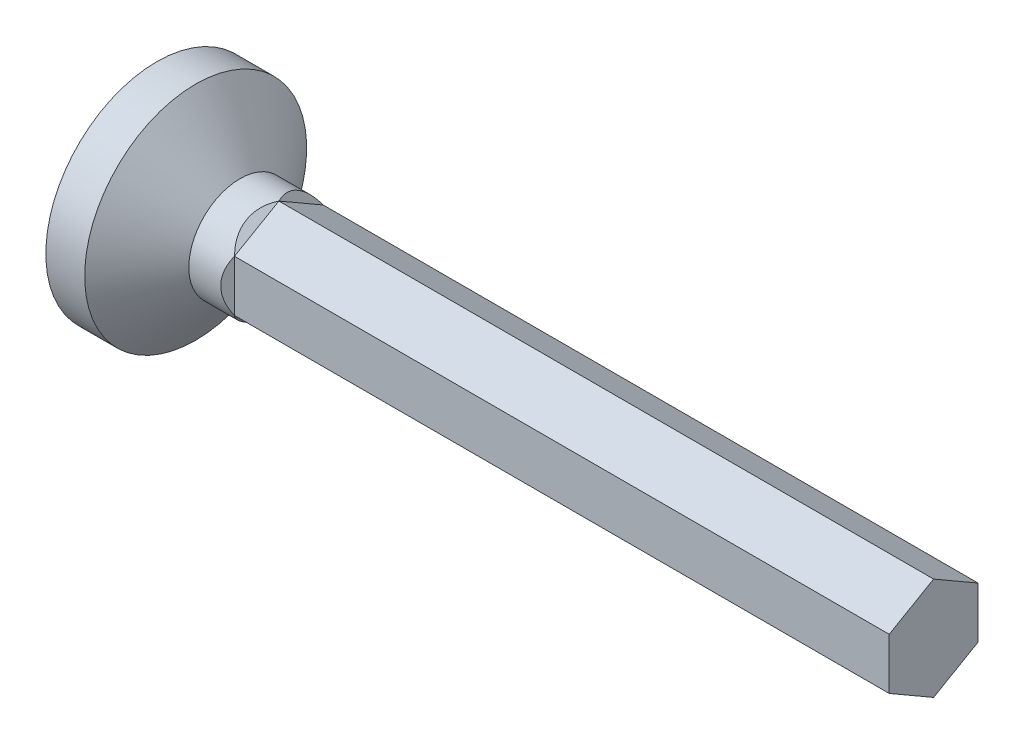
ISO-10303-21;
HEADER;
FILE_DESCRIPTION(('STEP AP214'),'2;1');
FILE_NAME('part.step','',(''),(''),'','','');
FILE_SCHEMA(('AUTOMOTIVE_DESIGN { 1 0 10303 214 1 1 1 1 }'));
ENDSEC;
DATA;
#1=APPLICATION_CONTEXT('core data for automotive mechanical design processes');
#2=APPLICATION_PROTOCOL_DEFINITION('international standard','automotive_design',2000,#1);
#3=PRODUCT_CONTEXT('',#1,'mechanical');
#4=PRODUCT('Part','Part','',(#3));
#5=PRODUCT_RELATED_PRODUCT_CATEGORY('part','',(#4));
#6=PRODUCT_DEFINITION_FORMATION('','',#4);
#7=PRODUCT_DEFINITION_CONTEXT('part definition',#1,'design');
#8=PRODUCT_DEFINITION('design','',#6,#7);
#9=PRODUCT_DEFINITION_SHAPE('','',#8);
#10=(LENGTH_UNIT() NAMED_UNIT(*) SI_UNIT(.MILLI.,.METRE.));
#11=(NAMED_UNIT(*) PLANE_ANGLE_UNIT() SI_UNIT($,.RADIAN.));
#12=(NAMED_UNIT(*) SI_UNIT($,.STERADIAN.) SOLID_ANGLE_UNIT());
#13=UNCERTAINTY_MEASURE_WITH_UNIT(LENGTH_MEASURE(1.E-05),#10,'distance_accuracy_value','');
#14=(GEOMETRIC_REPRESENTATION_CONTEXT(3) GLOBAL_UNCERTAINTY_ASSIGNED_CONTEXT((#13)) GLOBAL_UNIT_ASSIGNED_CONTEXT((#10,
#11,#12)) REPRESENTATION_CONTEXT('',''));
#15=CARTESIAN_POINT('',(0.,0.,0.));
#16=DIRECTION('',(0.,0.,1.));
#17=DIRECTION('',(1.,0.,0.));
#18=AXIS2_PLACEMENT_3D('',#15,#16,#17);
#19=CARTESIAN_POINT('',(30.,1.15470053837925,-2.));
#20=DIRECTION('',(0.,-0.866025403784439,0.5));
#21=DIRECTION('',(0.,-0.5,-0.866025403784439));
#22=AXIS2_PLACEMENT_3D('',#19,#20,#21);
#23=PLANE('',#22);
#24=DIRECTION('',(-1.,0.,0.));
#25=VECTOR('',#24,1.);
#26=CARTESIAN_POINT('',(30.,1.15470053837925,-2.));
#27=LINE('',#26,#25);
#28=CARTESIAN_POINT('',(30.,1.15470053837925,-2.));
#29=VERTEX_POINT('',#28);
#30=CARTESIAN_POINT('',(0.499999999999989,1.15470053837924,-2.00000000000002));
#31=VERTEX_POINT('',#30);
#32=EDGE_CURVE('E178',#29,#31,#27,.T.);
#33=ORIENTED_EDGE('',*,*,#32,.T.);
#34=DIRECTION('',(0.,0.5,0.866025403784439));
#35=VECTOR('',#34,1.);
#36=CARTESIAN_POINT('',(0.500000000000007,1.15470053837925,-2.));
#37=LINE('',#36,#35);
#38=CARTESIAN_POINT('',(0.500000000000007,2.3094010767585,0.));
#39=VERTEX_POINT('',#38);
#40=EDGE_CURVE('E129',#31,#39,#37,.T.);
#41=ORIENTED_EDGE('',*,*,#40,.T.);
#42=DIRECTION('',(-1.,0.,0.));
#43=VECTOR('',#42,1.);
#44=CARTESIAN_POINT('',(30.,2.3094010767585,0.));
#45=LINE('',#44,#43);
#46=CARTESIAN_POINT('',(30.,2.3094010767585,0.));
#47=VERTEX_POINT('',#46);
#48=EDGE_CURVE('E110',#47,#39,#45,.T.);
#49=ORIENTED_EDGE('',*,*,#48,.F.);
#50=DIRECTION('',(0.,0.5,0.866025403784439));
#51=VECTOR('',#50,1.);
#52=CARTESIAN_POINT('',(30.,1.15470053837925,-2.));
#53=LINE('',#52,#51);
#54=EDGE_CURVE('E117',#29,#47,#53,.T.);
#55=ORIENTED_EDGE('',*,*,#54,.F.);
#56=EDGE_LOOP('',(#33,#41,#49,#55));
#57=FACE_BOUND('',#56,.T.);
#58=ADVANCED_FACE('F47',(#57),#23,.F.);
#59=CARTESIAN_POINT('',(30.,2.3094010767585,0.));
#60=DIRECTION('',(0.,-0.866025403784439,-0.5));
#61=DIRECTION('',(0.,0.5,-0.866025403784439));
#62=AXIS2_PLACEMENT_3D('',#59,#60,#61);
#63=PLANE('',#62);
#64=ORIENTED_EDGE('',*,*,#48,.T.);
#65=DIRECTION('',(0.,-0.5,0.866025403784439));
#66=VECTOR('',#65,1.);
#67=CARTESIAN_POINT('',(0.500000000000007,2.3094010767585,0.));
#68=LINE('',#67,#66);
#69=CARTESIAN_POINT('',(0.49999999999999,1.15470053837927,2.));
#70=VERTEX_POINT('',#69);
#71=EDGE_CURVE('E136',#39,#70,#68,.T.);
#72=ORIENTED_EDGE('',*,*,#71,.T.);
#73=DIRECTION('',(-1.,0.,0.));
#74=VECTOR('',#73,1.);
#75=CARTESIAN_POINT('',(30.,1.15470053837925,2.));
#76=LINE('',#75,#74);
#77=CARTESIAN_POINT('',(30.,1.15470053837925,2.));
#78=VERTEX_POINT('',#77);
#79=EDGE_CURVE('E112',#78,#70,#76,.T.);
#80=ORIENTED_EDGE('',*,*,#79,.F.);
#81=DIRECTION('',(0.,-0.5,0.866025403784439));
#82=VECTOR('',#81,1.);
#83=CARTESIAN_POINT('',(30.,2.3094010767585,0.));
#84=LINE('',#83,#82);
#85=EDGE_CURVE('E105',#47,#78,#84,.T.);
#86=ORIENTED_EDGE('',*,*,#85,.F.);
#87=EDGE_LOOP('',(#64,#72,#80,#86));
#88=FACE_BOUND('',#87,.T.);
#89=ADVANCED_FACE('F107',(#88),#63,.F.);
#90=CARTESIAN_POINT('',(30.,1.15470053837925,2.));
#91=DIRECTION('',(0.,0.,-1.));
#92=DIRECTION('',(0.,1.,0.));
#93=AXIS2_PLACEMENT_3D('',#90,#91,#92);
#94=PLANE('',#93);
#95=ORIENTED_EDGE('',*,*,#79,.T.);
#96=DIRECTION('',(0.,-1.,0.));
#97=VECTOR('',#96,1.);
#98=CARTESIAN_POINT('',(0.500000000000007,1.15470053837925,2.));
#99=LINE('',#98,#97);
#100=CARTESIAN_POINT('',(0.49999999999999,-1.15470053837924,2.00000000000002));
#101=VERTEX_POINT('',#100);
#102=EDGE_CURVE('E154',#70,#101,#99,.T.);
#103=ORIENTED_EDGE('',*,*,#102,.T.);
#104=DIRECTION('',(-1.,0.,0.));
#105=VECTOR('',#104,1.);
#106=CARTESIAN_POINT('',(30.,-1.15470053837925,2.));
#107=LINE('',#106,#105);
#108=CARTESIAN_POINT('',(30.,-1.15470053837925,2.));
#109=VERTEX_POINT('',#108);
#110=EDGE_CURVE('E138',#109,#101,#107,.T.);
#111=ORIENTED_EDGE('',*,*,#110,.F.);
#112=DIRECTION('',(0.,-1.,0.));
#113=VECTOR('',#112,1.);
#114=CARTESIAN_POINT('',(30.,1.15470053837925,2.));
#115=LINE('',#114,#113);
#116=EDGE_CURVE('E116',#78,#109,#115,.T.);
#117=ORIENTED_EDGE('',*,*,#116,.F.);
#118=EDGE_LOOP('',(#95,#103,#111,#117));
#119=FACE_BOUND('',#118,.T.);
#120=ADVANCED_FACE('F199',(#119),#94,.F.);
#121=CARTESIAN_POINT('',(30.,-1.15470053837925,2.));
#122=DIRECTION('',(0.,0.866025403784439,-0.5));
#123=DIRECTION('',(0.,0.5,0.866025403784439));
#124=AXIS2_PLACEMENT_3D('',#121,#122,#123);
#125=PLANE('',#124);
#126=ORIENTED_EDGE('',*,*,#110,.T.);
#127=DIRECTION('',(0.,-0.5,-0.866025403784439));
#128=VECTOR('',#127,1.);
#129=CARTESIAN_POINT('',(0.500000000000007,-1.15470053837925,2.));
#130=LINE('',#129,#128);
#131=CARTESIAN_POINT('',(0.500000000000007,-2.3094010767585,0.));
#132=VERTEX_POINT('',#131);
#133=EDGE_CURVE('E165',#101,#132,#130,.T.);
#134=ORIENTED_EDGE('',*,*,#133,.T.);
#135=DIRECTION('',(-1.,0.,0.));
#136=VECTOR('',#135,1.);
#137=CARTESIAN_POINT('',(30.,-2.3094010767585,0.));
#138=LINE('',#137,#136);
#139=CARTESIAN_POINT('',(30.,-2.3094010767585,0.));
#140=VERTEX_POINT('',#139);
#141=EDGE_CURVE('E367',#140,#132,#138,.T.);
#142=ORIENTED_EDGE('',*,*,#141,.F.);
#143=DIRECTION('',(0.,-0.5,-0.866025403784439));
#144=VECTOR('',#143,1.);
#145=CARTESIAN_POINT('',(30.,-1.15470053837925,2.));
#146=LINE('',#145,#144);
#147=EDGE_CURVE('E355',#109,#140,#146,.T.);
#148=ORIENTED_EDGE('',*,*,#147,.F.);
#149=EDGE_LOOP('',(#126,#134,#142,#148));
#150=FACE_BOUND('',#149,.T.);
#151=ADVANCED_FACE('F315',(#150),#125,.F.);
#152=CARTESIAN_POINT('',(30.,-2.3094010767585,0.));
#153=DIRECTION('',(0.,0.866025403784438,0.5));
#154=DIRECTION('',(0.,-0.5,0.866025403784439));
#155=AXIS2_PLACEMENT_3D('',#152,#153,#154);
#156=PLANE('',#155);
#157=ORIENTED_EDGE('',*,*,#141,.T.);
#158=DIRECTION('',(0.,0.5,-0.866025403784439));
#159=VECTOR('',#158,1.);
#160=CARTESIAN_POINT('',(0.500000000000007,-2.3094010767585,0.));
#161=LINE('',#160,#159);
#162=CARTESIAN_POINT('',(0.49999999999999,-1.15470053837927,-2.));
#163=VERTEX_POINT('',#162);
#164=EDGE_CURVE('E131',#132,#163,#161,.T.);
#165=ORIENTED_EDGE('',*,*,#164,.T.);
#166=DIRECTION('',(-1.,0.,0.));
#167=VECTOR('',#166,1.);
#168=CARTESIAN_POINT('',(30.,-1.15470053837925,-2.));
#169=LINE('',#168,#167);
#170=CARTESIAN_POINT('',(30.,-1.15470053837925,-2.));
#171=VERTEX_POINT('',#170);
#172=EDGE_CURVE('E180',#171,#163,#169,.T.);
#173=ORIENTED_EDGE('',*,*,#172,.F.);
#174=DIRECTION('',(0.,0.5,-0.866025403784439));
#175=VECTOR('',#174,1.);
#176=CARTESIAN_POINT('',(30.,-2.3094010767585,0.));
#177=LINE('',#176,#175);
#178=EDGE_CURVE('E358',#140,#171,#177,.T.);
#179=ORIENTED_EDGE('',*,*,#178,.F.);
#180=EDGE_LOOP('',(#157,#165,#173,#179));
#181=FACE_BOUND('',#180,.T.);
#182=ADVANCED_FACE('F307',(#181),#156,.F.);
#183=CARTESIAN_POINT('',(30.,-1.15470053837925,-2.));
#184=DIRECTION('',(0.,0.,1.));
#185=DIRECTION('',(0.,-1.,0.));
#186=AXIS2_PLACEMENT_3D('',#183,#184,#185);
#187=PLANE('',#186);
#188=ORIENTED_EDGE('',*,*,#172,.T.);
#189=DIRECTION('',(0.,1.,0.));
#190=VECTOR('',#189,1.);
#191=CARTESIAN_POINT('',(0.500000000000007,-1.15470053837926,-2.));
#192=LINE('',#191,#190);
#193=EDGE_CURVE('E150',#163,#31,#192,.T.);
#194=ORIENTED_EDGE('',*,*,#193,.T.);
#195=ORIENTED_EDGE('',*,*,#32,.F.);
#196=DIRECTION('',(0.,1.,0.));
#197=VECTOR('',#196,1.);
#198=CARTESIAN_POINT('',(30.,-1.15470053837925,-2.));
#199=LINE('',#198,#197);
#200=EDGE_CURVE('E122',#171,#29,#199,.T.);
#201=ORIENTED_EDGE('',*,*,#200,.F.);
#202=EDGE_LOOP('',(#188,#194,#195,#201));
#203=FACE_BOUND('',#202,.T.);
#204=ADVANCED_FACE('F177',(#203),#187,.F.);
#205=CARTESIAN_POINT('',(30.,0.,0.));
#206=DIRECTION('',(1.,0.,0.));
#207=DIRECTION('',(0.,0.,-1.));
#208=AXIS2_PLACEMENT_3D('',#205,#206,#207);
#209=PLANE('',#208);
#210=ORIENTED_EDGE('',*,*,#54,.T.);
#211=ORIENTED_EDGE('',*,*,#85,.T.);
#212=ORIENTED_EDGE('',*,*,#116,.T.);
#213=ORIENTED_EDGE('',*,*,#147,.T.);
#214=ORIENTED_EDGE('',*,*,#178,.T.);
#215=ORIENTED_EDGE('',*,*,#200,.T.);
#216=EDGE_LOOP('',(#210,#211,#212,#213,#214,#215));
#217=FACE_BOUND('',#216,.T.);
#218=ADVANCED_FACE('F120',(#217),#209,.T.);
#219=CARTESIAN_POINT('',(-5.,0.,0.));
#220=DIRECTION('',(-1.,0.,0.));
#221=DIRECTION('',(0.,-1.,0.));
#222=AXIS2_PLACEMENT_3D('',#219,#220,#221);
#223=PLANE('',#222);
#224=CARTESIAN_POINT('',(-5.,0.,0.));
#225=DIRECTION('',(1.,0.,0.));
#226=DIRECTION('',(0.,1.,0.));
#227=AXIS2_PLACEMENT_3D('',#224,#225,#226);
#228=CIRCLE('',#227,5.);
#229=CARTESIAN_POINT('',(-5.,5.,0.));
#230=VERTEX_POINT('',#229);
#231=EDGE_CURVE('E127',#230,#230,#228,.T.);
#232=ORIENTED_EDGE('',*,*,#231,.F.);
#233=EDGE_LOOP('',(#232));
#234=FACE_BOUND('',#233,.T.);
#235=ADVANCED_FACE('F283',(#234),#223,.T.);
#236=CARTESIAN_POINT('',(0.,0.,0.));
#237=DIRECTION('',(1.,0.,0.));
#238=DIRECTION('',(0.,1.,0.));
#239=AXIS2_PLACEMENT_3D('',#236,#237,#238);
#240=CYLINDRICAL_SURFACE('',#239,5.);
#241=ORIENTED_EDGE('',*,*,#231,.T.);
#242=EDGE_LOOP('',(#241));
#243=FACE_BOUND('',#242,.T.);
#244=CARTESIAN_POINT('',(-3.25,0.,0.));
#245=DIRECTION('',(1.,0.,0.));
#246=DIRECTION('',(0.,1.,0.));
#247=AXIS2_PLACEMENT_3D('',#244,#245,#246);
#248=CIRCLE('',#247,5.);
#249=CARTESIAN_POINT('',(-3.25,5.,0.));
#250=VERTEX_POINT('',#249);
#251=EDGE_CURVE('E378',#250,#250,#248,.T.);
#252=ORIENTED_EDGE('',*,*,#251,.F.);
#253=EDGE_LOOP('',(#252));
#254=FACE_BOUND('',#253,.T.);
#255=ADVANCED_FACE('F274',(#243,#254),#240,.T.);
#256=CARTESIAN_POINT('',(-1.25,0.,0.));
#257=DIRECTION('',(-1.,0.,0.));
#258=DIRECTION('',(0.,-1.,0.));
#259=AXIS2_PLACEMENT_3D('',#256,#257,#258);
#260=CONICAL_SURFACE('',#259,2.3094010767585,0.931578396372235);
#261=ORIENTED_EDGE('',*,*,#251,.T.);
#262=EDGE_LOOP('',(#261));
#263=FACE_BOUND('',#262,.T.);
#264=CARTESIAN_POINT('',(-1.25,0.,0.));
#265=DIRECTION('',(1.,0.,0.));
#266=DIRECTION('',(0.,1.,0.));
#267=AXIS2_PLACEMENT_3D('',#264,#265,#266);
#268=CIRCLE('',#267,2.3094010767585);
#269=CARTESIAN_POINT('',(-1.25,2.3094010767585,0.));
#270=VERTEX_POINT('',#269);
#271=EDGE_CURVE('E382',#270,#270,#268,.T.);
#272=ORIENTED_EDGE('',*,*,#271,.F.);
#273=EDGE_LOOP('',(#272));
#274=FACE_BOUND('',#273,.T.);
#275=ADVANCED_FACE('F266',(#263,#274),#260,.T.);
#276=CARTESIAN_POINT('',(0.,0.,0.));
#277=DIRECTION('',(1.,0.,0.));
#278=DIRECTION('',(0.,1.,0.));
#279=AXIS2_PLACEMENT_3D('',#276,#277,#278);
#280=CYLINDRICAL_SURFACE('',#279,2.3094010767585);
#281=ORIENTED_EDGE('',*,*,#271,.T.);
#282=EDGE_LOOP('',(#281));
#283=FACE_BOUND('',#282,.T.);
#284=CARTESIAN_POINT('',(2.50000000000002,0.,0.));
#285=DIRECTION('',(-0.707106781186545,0.612372435695797,0.353553390593275));
#286=DIRECTION('',(0.70710678118655,0.612372435695792,0.353553390593273));
#287=AXIS2_PLACEMENT_3D('',#284,#285,#286);
#288=ELLIPSE('',#287,3.26598632371092,2.3094010767585);
#289=EDGE_CURVE('E144',#163,#132,#288,.T.);
#290=ORIENTED_EDGE('',*,*,#289,.T.);
#291=CARTESIAN_POINT('',(2.50000000000002,0.,0.));
#292=DIRECTION('',(-0.707106781186545,0.612372435695797,-0.353553390593275));
#293=DIRECTION('',(0.70710678118655,0.612372435695792,-0.353553390593272));
#294=AXIS2_PLACEMENT_3D('',#291,#292,#293);
#295=ELLIPSE('',#294,3.26598632371092,2.3094010767585);
#296=EDGE_CURVE('E11',#132,#101,#295,.T.);
#297=ORIENTED_EDGE('',*,*,#296,.T.);
#298=CARTESIAN_POINT('',(2.50000000000002,0.,0.));
#299=DIRECTION('',(-0.707106781186545,0.,-0.70710678118655));
#300=DIRECTION('',(0.70710678118655,0.,-0.707106781186545));
#301=AXIS2_PLACEMENT_3D('',#298,#299,#300);
#302=ELLIPSE('',#301,3.26598632371092,2.3094010767585);
#303=EDGE_CURVE('E80',#101,#70,#302,.T.);
#304=ORIENTED_EDGE('',*,*,#303,.T.);
#305=CARTESIAN_POINT('',(2.50000000000002,0.,0.));
#306=DIRECTION('',(-0.707106781186544,-0.612372435695797,-0.353553390593275));
#307=DIRECTION('',(0.707106781186551,-0.612372435695792,-0.353553390593272));
#308=AXIS2_PLACEMENT_3D('',#305,#306,#307);
#309=ELLIPSE('',#308,3.26598632371092,2.3094010767585);
#310=EDGE_CURVE('E147',#70,#39,#309,.T.);
#311=ORIENTED_EDGE('',*,*,#310,.T.);
#312=CARTESIAN_POINT('',(2.50000000000003,0.,0.));
#313=DIRECTION('',(-0.707106781186544,-0.612372435695797,0.353553390593275));
#314=DIRECTION('',(0.707106781186551,-0.612372435695792,0.353553390593272));
#315=AXIS2_PLACEMENT_3D('',#312,#313,#314);
#316=ELLIPSE('',#315,3.26598632371092,2.3094010767585);
#317=EDGE_CURVE('E58',#39,#31,#316,.T.);
#318=ORIENTED_EDGE('',*,*,#317,.T.);
#319=CARTESIAN_POINT('',(2.50000000000002,0.,0.));
#320=DIRECTION('',(-0.707106781186545,0.,0.70710678118655));
#321=DIRECTION('',(0.70710678118655,0.,0.707106781186545));
#322=AXIS2_PLACEMENT_3D('',#319,#320,#321);
#323=ELLIPSE('',#322,3.26598632371092,2.3094010767585);
#324=EDGE_CURVE('E158',#31,#163,#323,.T.);
#325=ORIENTED_EDGE('',*,*,#324,.T.);
#326=EDGE_LOOP('',(#290,#297,#304,#311,#318,#325));
#327=FACE_BOUND('',#326,.T.);
#328=ADVANCED_FACE('F169',(#283,#327),#280,.T.);
#329=CARTESIAN_POINT('',(0.500000000000007,-2.3094010767585,0.));
#330=DIRECTION('',(-0.707106781186545,0.612372435695797,0.353553390593275));
#331=DIRECTION('',(0.,0.5,-0.866025403784439));
#332=AXIS2_PLACEMENT_3D('',#329,#330,#331);
#333=PLANE('',#332);
#334=ORIENTED_EDGE('',*,*,#164,.F.);
#335=ORIENTED_EDGE('',*,*,#289,.F.);
#336=EDGE_LOOP('',(#334,#335));
#337=FACE_BOUND('',#336,.T.);
#338=ADVANCED_FACE('F204',(#337),#333,.F.);
#339=CARTESIAN_POINT('',(0.500000000000007,2.3094010767585,0.));
#340=DIRECTION('',(-0.707106781186544,-0.612372435695797,-0.353553390593275));
#341=DIRECTION('',(0.,-0.5,0.866025403784439));
#342=AXIS2_PLACEMENT_3D('',#339,#340,#341);
#343=PLANE('',#342);
#344=ORIENTED_EDGE('',*,*,#71,.F.);
#345=ORIENTED_EDGE('',*,*,#310,.F.);
#346=EDGE_LOOP('',(#344,#345));
#347=FACE_BOUND('',#346,.T.);
#348=ADVANCED_FACE('F210',(#347),#343,.F.);
#349=CARTESIAN_POINT('',(0.500000000000007,-1.15470053837926,-2.));
#350=DIRECTION('',(-0.707106781186545,0.,0.70710678118655));
#351=DIRECTION('',(0.,1.,0.));
#352=AXIS2_PLACEMENT_3D('',#349,#350,#351);
#353=PLANE('',#352);
#354=ORIENTED_EDGE('',*,*,#193,.F.);
#355=ORIENTED_EDGE('',*,*,#324,.F.);
#356=EDGE_LOOP('',(#354,#355));
#357=FACE_BOUND('',#356,.T.);
#358=ADVANCED_FACE('F174',(#357),#353,.F.);
#359=CARTESIAN_POINT('',(0.500000000000007,1.15470053837925,2.));
#360=DIRECTION('',(-0.707106781186545,0.,-0.70710678118655));
#361=DIRECTION('',(0.,-1.,0.));
#362=AXIS2_PLACEMENT_3D('',#359,#360,#361);
#363=PLANE('',#362);
#364=ORIENTED_EDGE('',*,*,#102,.F.);
#365=ORIENTED_EDGE('',*,*,#303,.F.);
#366=EDGE_LOOP('',(#364,#365));
#367=FACE_BOUND('',#366,.T.);
#368=ADVANCED_FACE('F185',(#367),#363,.F.);
#369=CARTESIAN_POINT('',(0.500000000000007,1.15470053837925,-2.));
#370=DIRECTION('',(-0.707106781186544,-0.612372435695797,0.353553390593275));
#371=DIRECTION('',(0.,0.5,0.866025403784439));
#372=AXIS2_PLACEMENT_3D('',#369,#370,#371);
#373=PLANE('',#372);
#374=ORIENTED_EDGE('',*,*,#40,.F.);
#375=ORIENTED_EDGE('',*,*,#317,.F.);
#376=EDGE_LOOP('',(#374,#375));
#377=FACE_BOUND('',#376,.T.);
#378=ADVANCED_FACE('F183',(#377),#373,.F.);
#379=CARTESIAN_POINT('',(0.500000000000007,-1.15470053837925,2.));
#380=DIRECTION('',(-0.707106781186545,0.612372435695797,-0.353553390593275));
#381=DIRECTION('',(0.,-0.5,-0.866025403784439));
#382=AXIS2_PLACEMENT_3D('',#379,#380,#381);
#383=PLANE('',#382);
#384=ORIENTED_EDGE('',*,*,#133,.F.);
#385=ORIENTED_EDGE('',*,*,#296,.F.);
#386=EDGE_LOOP('',(#384,#385));
#387=FACE_BOUND('',#386,.T.);
#388=ADVANCED_FACE('F50',(#387),#383,.F.);
#389=CLOSED_SHELL('',(#58,#89,#120,#151,#182,#204,#218,#235,#255,#275,#328,#338,#348,#358,#368,
#378,#388));
#390=MANIFOLD_SOLID_BREP('B2',#389);
#391=ADVANCED_BREP_SHAPE_REPRESENTATION('',(#18,#390),#14);
#392=SHAPE_DEFINITION_REPRESENTATION(#9,#391);
ENDSEC;
END-ISO-10303-21;
